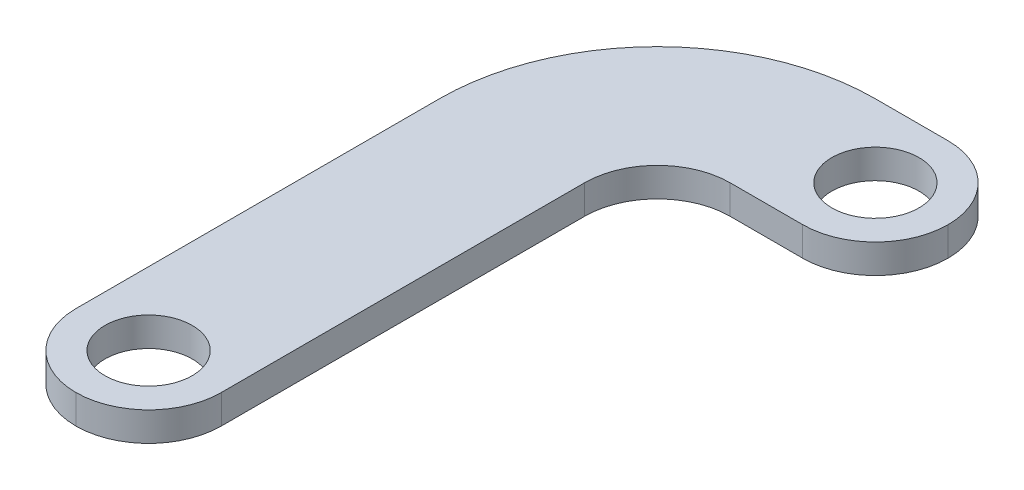
ISO-10303-21;
HEADER;
FILE_DESCRIPTION(('STEP AP214'),'2;1');
FILE_NAME('part.step','',(''),(''),'','','');
FILE_SCHEMA(('AUTOMOTIVE_DESIGN { 1 0 10303 214 1 1 1 1 }'));
ENDSEC;
DATA;
#1=APPLICATION_CONTEXT('core data for automotive mechanical design processes');
#2=APPLICATION_PROTOCOL_DEFINITION('international standard','automotive_design',2000,#1);
#3=PRODUCT_CONTEXT('',#1,'mechanical');
#4=PRODUCT('Part','Part','',(#3));
#5=PRODUCT_RELATED_PRODUCT_CATEGORY('part','',(#4));
#6=PRODUCT_DEFINITION_FORMATION('','',#4);
#7=PRODUCT_DEFINITION_CONTEXT('part definition',#1,'design');
#8=PRODUCT_DEFINITION('design','',#6,#7);
#9=PRODUCT_DEFINITION_SHAPE('','',#8);
#10=(LENGTH_UNIT() NAMED_UNIT(*) SI_UNIT(.MILLI.,.METRE.));
#11=(NAMED_UNIT(*) PLANE_ANGLE_UNIT() SI_UNIT($,.RADIAN.));
#12=(NAMED_UNIT(*) SI_UNIT($,.STERADIAN.) SOLID_ANGLE_UNIT());
#13=UNCERTAINTY_MEASURE_WITH_UNIT(LENGTH_MEASURE(1.E-05),#10,'distance_accuracy_value','');
#14=(GEOMETRIC_REPRESENTATION_CONTEXT(3) GLOBAL_UNCERTAINTY_ASSIGNED_CONTEXT((#13)) GLOBAL_UNIT_ASSIGNED_CONTEXT((#10,
#11,#12)) REPRESENTATION_CONTEXT('',''));
#15=CARTESIAN_POINT('',(0.,0.,0.));
#16=DIRECTION('',(0.,0.,1.));
#17=DIRECTION('',(1.,0.,0.));
#18=AXIS2_PLACEMENT_3D('',#15,#16,#17);
#19=CARTESIAN_POINT('',(5.,2.,-5.));
#20=DIRECTION('',(0.,-1.,0.));
#21=DIRECTION('',(0.,0.,-1.));
#22=AXIS2_PLACEMENT_3D('',#19,#20,#21);
#23=CYLINDRICAL_SURFACE('',#22,5.);
#24=CARTESIAN_POINT('',(5.,2.,-5.));
#25=DIRECTION('',(0.,1.,0.));
#26=DIRECTION('',(0.,0.,-1.));
#27=AXIS2_PLACEMENT_3D('',#24,#25,#26);
#28=CIRCLE('',#27,5.);
#29=CARTESIAN_POINT('',(0.,2.,-5.));
#30=VERTEX_POINT('',#29);
#31=CARTESIAN_POINT('',(5.,2.,0.));
#32=VERTEX_POINT('',#31);
#33=EDGE_CURVE('E222',#30,#32,#28,.T.);
#34=ORIENTED_EDGE('',*,*,#33,.F.);
#35=DIRECTION('',(0.,1.,0.));
#36=VECTOR('',#35,1.);
#37=CARTESIAN_POINT('',(0.,2.,-5.));
#38=LINE('',#37,#36);
#39=CARTESIAN_POINT('',(0.,0.,-5.));
#40=VERTEX_POINT('',#39);
#41=EDGE_CURVE('E175',#40,#30,#38,.T.);
#42=ORIENTED_EDGE('',*,*,#41,.F.);
#43=CARTESIAN_POINT('',(5.,0.,-5.));
#44=DIRECTION('',(0.,-1.,0.));
#45=DIRECTION('',(0.,0.,-1.));
#46=AXIS2_PLACEMENT_3D('',#43,#44,#45);
#47=CIRCLE('',#46,5.);
#48=CARTESIAN_POINT('',(5.,0.,0.));
#49=VERTEX_POINT('',#48);
#50=EDGE_CURVE('E193',#49,#40,#47,.T.);
#51=ORIENTED_EDGE('',*,*,#50,.F.);
#52=DIRECTION('',(0.,1.,0.));
#53=VECTOR('',#52,1.);
#54=CARTESIAN_POINT('',(5.,2.,0.));
#55=LINE('',#54,#53);
#56=EDGE_CURVE('E11',#49,#32,#55,.T.);
#57=ORIENTED_EDGE('',*,*,#56,.T.);
#58=EDGE_LOOP('',(#34,#42,#51,#57));
#59=FACE_BOUND('',#58,.T.);
#60=ADVANCED_FACE('F17',(#59),#23,.T.);
#61=CARTESIAN_POINT('',(5.,2.,-5.));
#62=DIRECTION('',(0.,-1.,0.));
#63=DIRECTION('',(0.,0.,-1.));
#64=AXIS2_PLACEMENT_3D('',#61,#62,#63);
#65=CYLINDRICAL_SURFACE('',#64,5.);
#66=DIRECTION('',(0.,-1.,0.));
#67=VECTOR('',#66,1.);
#68=CARTESIAN_POINT('',(10.,2.,-5.));
#69=LINE('',#68,#67);
#70=CARTESIAN_POINT('',(10.,2.,-5.));
#71=VERTEX_POINT('',#70);
#72=CARTESIAN_POINT('',(10.,0.,-5.));
#73=VERTEX_POINT('',#72);
#74=EDGE_CURVE('E177',#71,#73,#69,.T.);
#75=ORIENTED_EDGE('',*,*,#74,.F.);
#76=CARTESIAN_POINT('',(5.,2.,-5.));
#77=DIRECTION('',(0.,1.,0.));
#78=DIRECTION('',(0.,0.,-1.));
#79=AXIS2_PLACEMENT_3D('',#76,#77,#78);
#80=CIRCLE('',#79,5.);
#81=EDGE_CURVE('E150',#32,#71,#80,.T.);
#82=ORIENTED_EDGE('',*,*,#81,.F.);
#83=ORIENTED_EDGE('',*,*,#56,.F.);
#84=CARTESIAN_POINT('',(5.,0.,-5.));
#85=DIRECTION('',(0.,-1.,0.));
#86=DIRECTION('',(0.,0.,-1.));
#87=AXIS2_PLACEMENT_3D('',#84,#85,#86);
#88=CIRCLE('',#87,5.);
#89=EDGE_CURVE('E189',#73,#49,#88,.T.);
#90=ORIENTED_EDGE('',*,*,#89,.F.);
#91=EDGE_LOOP('',(#75,#82,#83,#90));
#92=FACE_BOUND('',#91,.T.);
#93=ADVANCED_FACE('F531',(#92),#65,.T.);
#94=CARTESIAN_POINT('',(20.,2.,-40.));
#95=DIRECTION('',(0.,-1.,0.));
#96=DIRECTION('',(0.,0.,-1.));
#97=AXIS2_PLACEMENT_3D('',#94,#95,#96);
#98=CYLINDRICAL_SURFACE('',#97,5.);
#99=CARTESIAN_POINT('',(20.,2.,-40.));
#100=DIRECTION('',(0.,1.,0.));
#101=DIRECTION('',(0.,0.,-1.));
#102=AXIS2_PLACEMENT_3D('',#99,#100,#101);
#103=CIRCLE('',#102,5.);
#104=CARTESIAN_POINT('',(25.,2.,-40.));
#105=VERTEX_POINT('',#104);
#106=CARTESIAN_POINT('',(20.,2.,-45.));
#107=VERTEX_POINT('',#106);
#108=EDGE_CURVE('E215',#105,#107,#103,.T.);
#109=ORIENTED_EDGE('',*,*,#108,.F.);
#110=DIRECTION('',(0.,-1.,0.));
#111=VECTOR('',#110,1.);
#112=CARTESIAN_POINT('',(25.,2.,-40.));
#113=LINE('',#112,#111);
#114=CARTESIAN_POINT('',(25.,0.,-40.));
#115=VERTEX_POINT('',#114);
#116=EDGE_CURVE('E25',#105,#115,#113,.T.);
#117=ORIENTED_EDGE('',*,*,#116,.T.);
#118=CARTESIAN_POINT('',(20.,0.,-40.));
#119=DIRECTION('',(0.,-1.,0.));
#120=DIRECTION('',(0.,0.,-1.));
#121=AXIS2_PLACEMENT_3D('',#118,#119,#120);
#122=CIRCLE('',#121,5.);
#123=CARTESIAN_POINT('',(20.,0.,-45.));
#124=VERTEX_POINT('',#123);
#125=EDGE_CURVE('E233',#124,#115,#122,.T.);
#126=ORIENTED_EDGE('',*,*,#125,.F.);
#127=DIRECTION('',(0.,-1.,0.));
#128=VECTOR('',#127,1.);
#129=CARTESIAN_POINT('',(20.,2.,-45.));
#130=LINE('',#129,#128);
#131=EDGE_CURVE('E198',#107,#124,#130,.T.);
#132=ORIENTED_EDGE('',*,*,#131,.F.);
#133=EDGE_LOOP('',(#109,#117,#126,#132));
#134=FACE_BOUND('',#133,.T.);
#135=ADVANCED_FACE('F254',(#134),#98,.T.);
#136=CARTESIAN_POINT('',(20.,2.,-40.));
#137=DIRECTION('',(0.,-1.,0.));
#138=DIRECTION('',(0.,0.,-1.));
#139=AXIS2_PLACEMENT_3D('',#136,#137,#138);
#140=CYLINDRICAL_SURFACE('',#139,5.);
#141=ORIENTED_EDGE('',*,*,#116,.F.);
#142=CARTESIAN_POINT('',(20.,2.,-40.));
#143=DIRECTION('',(0.,1.,0.));
#144=DIRECTION('',(0.,0.,-1.));
#145=AXIS2_PLACEMENT_3D('',#142,#143,#144);
#146=CIRCLE('',#145,5.);
#147=CARTESIAN_POINT('',(20.,2.,-35.));
#148=VERTEX_POINT('',#147);
#149=EDGE_CURVE('E212',#148,#105,#146,.T.);
#150=ORIENTED_EDGE('',*,*,#149,.F.);
#151=DIRECTION('',(0.,1.,0.));
#152=VECTOR('',#151,1.);
#153=CARTESIAN_POINT('',(20.,2.,-35.));
#154=LINE('',#153,#152);
#155=CARTESIAN_POINT('',(20.,0.,-35.));
#156=VERTEX_POINT('',#155);
#157=EDGE_CURVE('E164',#156,#148,#154,.T.);
#158=ORIENTED_EDGE('',*,*,#157,.F.);
#159=CARTESIAN_POINT('',(20.,0.,-40.));
#160=DIRECTION('',(0.,-1.,0.));
#161=DIRECTION('',(0.,0.,-1.));
#162=AXIS2_PLACEMENT_3D('',#159,#160,#161);
#163=CIRCLE('',#162,5.);
#164=EDGE_CURVE('E237',#115,#156,#163,.T.);
#165=ORIENTED_EDGE('',*,*,#164,.F.);
#166=EDGE_LOOP('',(#141,#150,#158,#165));
#167=FACE_BOUND('',#166,.T.);
#168=ADVANCED_FACE('F258',(#167),#140,.T.);
#169=CARTESIAN_POINT('',(15.,2.,-30.));
#170=DIRECTION('',(0.,-1.,0.));
#171=DIRECTION('',(0.,0.,-1.));
#172=AXIS2_PLACEMENT_3D('',#169,#170,#171);
#173=CYLINDRICAL_SURFACE('',#172,15.);
#174=CARTESIAN_POINT('',(15.,2.,-30.));
#175=DIRECTION('',(0.,1.,0.));
#176=DIRECTION('',(0.,0.,-1.));
#177=AXIS2_PLACEMENT_3D('',#174,#175,#176);
#178=CIRCLE('',#177,15.);
#179=CARTESIAN_POINT('',(15.,2.,-45.));
#180=VERTEX_POINT('',#179);
#181=CARTESIAN_POINT('',(0.,2.,-30.));
#182=VERTEX_POINT('',#181);
#183=EDGE_CURVE('E219',#180,#182,#178,.T.);
#184=ORIENTED_EDGE('',*,*,#183,.F.);
#185=DIRECTION('',(0.,1.,0.));
#186=VECTOR('',#185,1.);
#187=CARTESIAN_POINT('',(15.,2.,-45.));
#188=LINE('',#187,#186);
#189=CARTESIAN_POINT('',(15.,0.,-45.));
#190=VERTEX_POINT('',#189);
#191=EDGE_CURVE('E216',#190,#180,#188,.T.);
#192=ORIENTED_EDGE('',*,*,#191,.F.);
#193=CARTESIAN_POINT('',(15.,0.,-30.));
#194=DIRECTION('',(0.,-1.,0.));
#195=DIRECTION('',(0.,0.,-1.));
#196=AXIS2_PLACEMENT_3D('',#193,#194,#195);
#197=CIRCLE('',#196,15.);
#198=CARTESIAN_POINT('',(0.,0.,-30.));
#199=VERTEX_POINT('',#198);
#200=EDGE_CURVE('E244',#199,#190,#197,.T.);
#201=ORIENTED_EDGE('',*,*,#200,.F.);
#202=DIRECTION('',(0.,-1.,0.));
#203=VECTOR('',#202,1.);
#204=CARTESIAN_POINT('',(0.,2.,-30.));
#205=LINE('',#204,#203);
#206=EDGE_CURVE('E182',#182,#199,#205,.T.);
#207=ORIENTED_EDGE('',*,*,#206,.F.);
#208=EDGE_LOOP('',(#184,#192,#201,#207));
#209=FACE_BOUND('',#208,.T.);
#210=ADVANCED_FACE('F274',(#209),#173,.T.);
#211=CARTESIAN_POINT('',(15.,2.,-30.));
#212=DIRECTION('',(0.,1.,0.));
#213=DIRECTION('',(0.,0.,1.));
#214=AXIS2_PLACEMENT_3D('',#211,#212,#213);
#215=CYLINDRICAL_SURFACE('',#214,5.);
#216=CARTESIAN_POINT('',(15.,2.,-30.));
#217=DIRECTION('',(0.,-1.,0.));
#218=DIRECTION('',(0.,0.,-1.));
#219=AXIS2_PLACEMENT_3D('',#216,#217,#218);
#220=CIRCLE('',#219,5.);
#221=CARTESIAN_POINT('',(10.,2.,-30.));
#222=VERTEX_POINT('',#221);
#223=CARTESIAN_POINT('',(15.,2.,-35.));
#224=VERTEX_POINT('',#223);
#225=EDGE_CURVE('E136',#222,#224,#220,.T.);
#226=ORIENTED_EDGE('',*,*,#225,.F.);
#227=DIRECTION('',(0.,1.,0.));
#228=VECTOR('',#227,1.);
#229=CARTESIAN_POINT('',(10.,2.,-30.));
#230=LINE('',#229,#228);
#231=CARTESIAN_POINT('',(10.,0.,-30.));
#232=VERTEX_POINT('',#231);
#233=EDGE_CURVE('E197',#232,#222,#230,.T.);
#234=ORIENTED_EDGE('',*,*,#233,.F.);
#235=CARTESIAN_POINT('',(15.,0.,-30.));
#236=DIRECTION('',(0.,1.,0.));
#237=DIRECTION('',(0.,0.,-1.));
#238=AXIS2_PLACEMENT_3D('',#235,#236,#237);
#239=CIRCLE('',#238,5.);
#240=CARTESIAN_POINT('',(15.,0.,-35.));
#241=VERTEX_POINT('',#240);
#242=EDGE_CURVE('E155',#241,#232,#239,.T.);
#243=ORIENTED_EDGE('',*,*,#242,.F.);
#244=DIRECTION('',(0.,-1.,0.));
#245=VECTOR('',#244,1.);
#246=CARTESIAN_POINT('',(15.,0.,-35.));
#247=LINE('',#246,#245);
#248=EDGE_CURVE('E153',#224,#241,#247,.T.);
#249=ORIENTED_EDGE('',*,*,#248,.F.);
#250=EDGE_LOOP('',(#226,#234,#243,#249));
#251=FACE_BOUND('',#250,.T.);
#252=ADVANCED_FACE('F154',(#251),#215,.F.);
#253=CARTESIAN_POINT('',(5.,0.,-5.));
#254=DIRECTION('',(0.,1.,0.));
#255=DIRECTION('',(0.,0.,1.));
#256=AXIS2_PLACEMENT_3D('',#253,#254,#255);
#257=CYLINDRICAL_SURFACE('',#256,3.);
#258=CARTESIAN_POINT('',(5.,0.,-5.));
#259=DIRECTION('',(0.,1.,0.));
#260=DIRECTION('',(0.,0.,1.));
#261=AXIS2_PLACEMENT_3D('',#258,#259,#260);
#262=CIRCLE('',#261,3.);
#263=CARTESIAN_POINT('',(5.,0.,-2.));
#264=VERTEX_POINT('',#263);
#265=EDGE_CURVE('E44',#264,#264,#262,.T.);
#266=ORIENTED_EDGE('',*,*,#265,.F.);
#267=EDGE_LOOP('',(#266));
#268=FACE_BOUND('',#267,.T.);
#269=CARTESIAN_POINT('',(5.,2.,-5.));
#270=DIRECTION('',(0.,1.,0.));
#271=DIRECTION('',(0.,0.,1.));
#272=AXIS2_PLACEMENT_3D('',#269,#270,#271);
#273=CIRCLE('',#272,3.);
#274=CARTESIAN_POINT('',(5.,2.,-2.));
#275=VERTEX_POINT('',#274);
#276=EDGE_CURVE('E149',#275,#275,#273,.T.);
#277=ORIENTED_EDGE('',*,*,#276,.T.);
#278=EDGE_LOOP('',(#277));
#279=FACE_BOUND('',#278,.T.);
#280=ADVANCED_FACE('F470',(#268,#279),#257,.F.);
#281=CARTESIAN_POINT('',(20.,0.,-40.));
#282=DIRECTION('',(0.,1.,0.));
#283=DIRECTION('',(0.,0.,1.));
#284=AXIS2_PLACEMENT_3D('',#281,#282,#283);
#285=CYLINDRICAL_SURFACE('',#284,3.);
#286=CARTESIAN_POINT('',(20.,0.,-40.));
#287=DIRECTION('',(0.,1.,0.));
#288=DIRECTION('',(0.,0.,1.));
#289=AXIS2_PLACEMENT_3D('',#286,#287,#288);
#290=CIRCLE('',#289,3.);
#291=CARTESIAN_POINT('',(20.,0.,-37.));
#292=VERTEX_POINT('',#291);
#293=EDGE_CURVE('E36',#292,#292,#290,.T.);
#294=ORIENTED_EDGE('',*,*,#293,.F.);
#295=EDGE_LOOP('',(#294));
#296=FACE_BOUND('',#295,.T.);
#297=CARTESIAN_POINT('',(20.,2.,-40.));
#298=DIRECTION('',(0.,1.,0.));
#299=DIRECTION('',(0.,0.,1.));
#300=AXIS2_PLACEMENT_3D('',#297,#298,#299);
#301=CIRCLE('',#300,3.);
#302=CARTESIAN_POINT('',(20.,2.,-37.));
#303=VERTEX_POINT('',#302);
#304=EDGE_CURVE('E230',#303,#303,#301,.T.);
#305=ORIENTED_EDGE('',*,*,#304,.T.);
#306=EDGE_LOOP('',(#305));
#307=FACE_BOUND('',#306,.T.);
#308=ADVANCED_FACE('F466',(#296,#307),#285,.F.);
#309=CARTESIAN_POINT('',(0.,0.,0.));
#310=DIRECTION('',(0.,-1.,0.));
#311=DIRECTION('',(0.,0.,-1.));
#312=AXIS2_PLACEMENT_3D('',#309,#310,#311);
#313=PLANE('',#312);
#314=ORIENTED_EDGE('',*,*,#293,.T.);
#315=EDGE_LOOP('',(#314));
#316=FACE_BOUND('',#315,.T.);
#317=ORIENTED_EDGE('',*,*,#265,.T.);
#318=EDGE_LOOP('',(#317));
#319=FACE_BOUND('',#318,.T.);
#320=DIRECTION('',(-1.,0.,0.));
#321=VECTOR('',#320,1.);
#322=CARTESIAN_POINT('',(0.,0.,-45.));
#323=LINE('',#322,#321);
#324=EDGE_CURVE('E202',#124,#190,#323,.T.);
#325=ORIENTED_EDGE('',*,*,#324,.F.);
#326=ORIENTED_EDGE('',*,*,#125,.T.);
#327=ORIENTED_EDGE('',*,*,#164,.T.);
#328=DIRECTION('',(1.,0.,0.));
#329=VECTOR('',#328,1.);
#330=CARTESIAN_POINT('',(10.,0.,-35.));
#331=LINE('',#330,#329);
#332=EDGE_CURVE('E171',#241,#156,#331,.T.);
#333=ORIENTED_EDGE('',*,*,#332,.F.);
#334=ORIENTED_EDGE('',*,*,#242,.T.);
#335=DIRECTION('',(0.,0.,-1.));
#336=VECTOR('',#335,1.);
#337=CARTESIAN_POINT('',(10.,0.,0.));
#338=LINE('',#337,#336);
#339=EDGE_CURVE('E181',#73,#232,#338,.T.);
#340=ORIENTED_EDGE('',*,*,#339,.F.);
#341=ORIENTED_EDGE('',*,*,#89,.T.);
#342=ORIENTED_EDGE('',*,*,#50,.T.);
#343=DIRECTION('',(0.,0.,1.));
#344=VECTOR('',#343,1.);
#345=CARTESIAN_POINT('',(0.,0.,0.));
#346=LINE('',#345,#344);
#347=EDGE_CURVE('E284',#199,#40,#346,.T.);
#348=ORIENTED_EDGE('',*,*,#347,.F.);
#349=ORIENTED_EDGE('',*,*,#200,.T.);
#350=EDGE_LOOP('',(#325,#326,#327,#333,#334,#340,#341,#342,#348,#349));
#351=FACE_BOUND('',#350,.T.);
#352=ADVANCED_FACE('F260',(#316,#319,#351),#313,.T.);
#353=CARTESIAN_POINT('',(0.,2.,0.));
#354=DIRECTION('',(0.,-1.,0.));
#355=DIRECTION('',(0.,0.,-1.));
#356=AXIS2_PLACEMENT_3D('',#353,#354,#355);
#357=PLANE('',#356);
#358=ORIENTED_EDGE('',*,*,#304,.F.);
#359=EDGE_LOOP('',(#358));
#360=FACE_BOUND('',#359,.T.);
#361=ORIENTED_EDGE('',*,*,#276,.F.);
#362=EDGE_LOOP('',(#361));
#363=FACE_BOUND('',#362,.T.);
#364=ORIENTED_EDGE('',*,*,#149,.T.);
#365=ORIENTED_EDGE('',*,*,#108,.T.);
#366=DIRECTION('',(-1.,0.,0.));
#367=VECTOR('',#366,1.);
#368=CARTESIAN_POINT('',(0.,2.,-45.));
#369=LINE('',#368,#367);
#370=EDGE_CURVE('E160',#107,#180,#369,.T.);
#371=ORIENTED_EDGE('',*,*,#370,.T.);
#372=ORIENTED_EDGE('',*,*,#183,.T.);
#373=DIRECTION('',(0.,0.,1.));
#374=VECTOR('',#373,1.);
#375=CARTESIAN_POINT('',(0.,2.,0.));
#376=LINE('',#375,#374);
#377=EDGE_CURVE('E186',#182,#30,#376,.T.);
#378=ORIENTED_EDGE('',*,*,#377,.T.);
#379=ORIENTED_EDGE('',*,*,#33,.T.);
#380=ORIENTED_EDGE('',*,*,#81,.T.);
#381=DIRECTION('',(0.,0.,-1.));
#382=VECTOR('',#381,1.);
#383=CARTESIAN_POINT('',(10.,2.,0.));
#384=LINE('',#383,#382);
#385=EDGE_CURVE('E144',#71,#222,#384,.T.);
#386=ORIENTED_EDGE('',*,*,#385,.T.);
#387=ORIENTED_EDGE('',*,*,#225,.T.);
#388=DIRECTION('',(1.,0.,0.));
#389=VECTOR('',#388,1.);
#390=CARTESIAN_POINT('',(10.,2.,-35.));
#391=LINE('',#390,#389);
#392=EDGE_CURVE('E141',#224,#148,#391,.T.);
#393=ORIENTED_EDGE('',*,*,#392,.T.);
#394=EDGE_LOOP('',(#364,#365,#371,#372,#378,#379,#380,#386,#387,#393));
#395=FACE_BOUND('',#394,.T.);
#396=ADVANCED_FACE('F139',(#360,#363,#395),#357,.F.);
#397=CARTESIAN_POINT('',(0.,2.,-45.));
#398=DIRECTION('',(0.,0.,1.));
#399=DIRECTION('',(1.,0.,0.));
#400=AXIS2_PLACEMENT_3D('',#397,#398,#399);
#401=PLANE('',#400);
#402=ORIENTED_EDGE('',*,*,#370,.F.);
#403=ORIENTED_EDGE('',*,*,#131,.T.);
#404=ORIENTED_EDGE('',*,*,#324,.T.);
#405=ORIENTED_EDGE('',*,*,#191,.T.);
#406=EDGE_LOOP('',(#402,#403,#404,#405));
#407=FACE_BOUND('',#406,.T.);
#408=ADVANCED_FACE('F268',(#407),#401,.F.);
#409=CARTESIAN_POINT('',(10.,2.,-35.));
#410=DIRECTION('',(0.,0.,-1.));
#411=DIRECTION('',(0.,-1.,0.));
#412=AXIS2_PLACEMENT_3D('',#409,#410,#411);
#413=PLANE('',#412);
#414=ORIENTED_EDGE('',*,*,#332,.T.);
#415=ORIENTED_EDGE('',*,*,#157,.T.);
#416=ORIENTED_EDGE('',*,*,#392,.F.);
#417=ORIENTED_EDGE('',*,*,#248,.T.);
#418=EDGE_LOOP('',(#414,#415,#416,#417));
#419=FACE_BOUND('',#418,.T.);
#420=ADVANCED_FACE('F162',(#419),#413,.F.);
#421=CARTESIAN_POINT('',(10.,2.,0.));
#422=DIRECTION('',(-1.,0.,0.));
#423=DIRECTION('',(0.,0.,1.));
#424=AXIS2_PLACEMENT_3D('',#421,#422,#423);
#425=PLANE('',#424);
#426=ORIENTED_EDGE('',*,*,#385,.F.);
#427=ORIENTED_EDGE('',*,*,#74,.T.);
#428=ORIENTED_EDGE('',*,*,#339,.T.);
#429=ORIENTED_EDGE('',*,*,#233,.T.);
#430=EDGE_LOOP('',(#426,#427,#428,#429));
#431=FACE_BOUND('',#430,.T.);
#432=ADVANCED_FACE('F454',(#431),#425,.F.);
#433=CARTESIAN_POINT('',(0.,2.,0.));
#434=DIRECTION('',(1.,0.,0.));
#435=DIRECTION('',(0.,1.,0.));
#436=AXIS2_PLACEMENT_3D('',#433,#434,#435);
#437=PLANE('',#436);
#438=ORIENTED_EDGE('',*,*,#347,.T.);
#439=ORIENTED_EDGE('',*,*,#41,.T.);
#440=ORIENTED_EDGE('',*,*,#377,.F.);
#441=ORIENTED_EDGE('',*,*,#206,.T.);
#442=EDGE_LOOP('',(#438,#439,#440,#441));
#443=FACE_BOUND('',#442,.T.);
#444=ADVANCED_FACE('F277',(#443),#437,.F.);
#445=CLOSED_SHELL('',(#60,#93,#135,#168,#210,#252,#280,#308,#352,#396,#408,#420,#432,#444));
#446=MANIFOLD_SOLID_BREP('B1',#445);
#447=ADVANCED_BREP_SHAPE_REPRESENTATION('',(#18,#446),#14);
#448=SHAPE_DEFINITION_REPRESENTATION(#9,#447);
ENDSEC;
END-ISO-10303-21;
